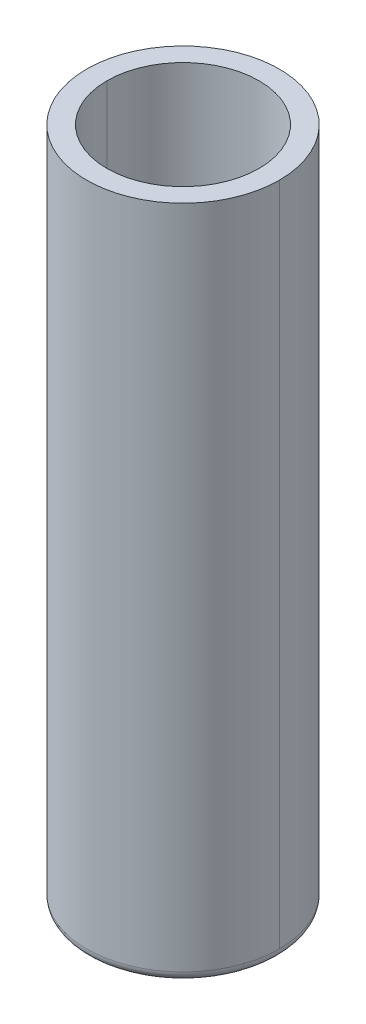
ISO-10303-21;
HEADER;
FILE_DESCRIPTION(('STEP AP214'),'2;1');
FILE_NAME('part.step','',(''),(''),'','','');
FILE_SCHEMA(('AUTOMOTIVE_DESIGN { 1 0 10303 214 1 1 1 1 }'));
ENDSEC;
DATA;
#1=APPLICATION_CONTEXT('core data for automotive mechanical design processes');
#2=APPLICATION_PROTOCOL_DEFINITION('international standard','automotive_design',2000,#1);
#3=PRODUCT_CONTEXT('',#1,'mechanical');
#4=PRODUCT('Part','Part','',(#3));
#5=PRODUCT_RELATED_PRODUCT_CATEGORY('part','',(#4));
#6=PRODUCT_DEFINITION_FORMATION('','',#4);
#7=PRODUCT_DEFINITION_CONTEXT('part definition',#1,'design');
#8=PRODUCT_DEFINITION('design','',#6,#7);
#9=PRODUCT_DEFINITION_SHAPE('','',#8);
#10=(LENGTH_UNIT() NAMED_UNIT(*) SI_UNIT(.MILLI.,.METRE.));
#11=(NAMED_UNIT(*) PLANE_ANGLE_UNIT() SI_UNIT($,.RADIAN.));
#12=(NAMED_UNIT(*) SI_UNIT($,.STERADIAN.) SOLID_ANGLE_UNIT());
#13=UNCERTAINTY_MEASURE_WITH_UNIT(LENGTH_MEASURE(1.E-05),#10,'distance_accuracy_value','');
#14=(GEOMETRIC_REPRESENTATION_CONTEXT(3) GLOBAL_UNCERTAINTY_ASSIGNED_CONTEXT((#13)) GLOBAL_UNIT_ASSIGNED_CONTEXT((#10,
#11,#12)) REPRESENTATION_CONTEXT('',''));
#15=CARTESIAN_POINT('',(0.,0.,0.));
#16=DIRECTION('',(0.,0.,1.));
#17=DIRECTION('',(1.,0.,0.));
#18=AXIS2_PLACEMENT_3D('',#15,#16,#17);
#19=CARTESIAN_POINT('',(0.,0.644355282187,0.774237036705));
#20=DIRECTION('',(0.,1.,0.));
#21=DIRECTION('',(0.,0.,1.));
#22=AXIS2_PLACEMENT_3D('',#19,#20,#21);
#23=PLANE('',#22);
#24=CARTESIAN_POINT('',(0.,0.644355282187,0.));
#25=DIRECTION('',(0.,-1.,0.));
#26=DIRECTION('',(0.,0.,-1.));
#27=AXIS2_PLACEMENT_3D('',#24,#25,#26);
#28=CIRCLE('',#27,0.774237036705);
#29=CARTESIAN_POINT('',(0.371189008329905,0.644355282187,0.679456922181827));
#30=VERTEX_POINT('',#29);
#31=EDGE_CURVE('E19',#30,#30,#28,.T.);
#32=ORIENTED_EDGE('',*,*,#31,.T.);
#33=EDGE_LOOP('',(#32));
#34=FACE_BOUND('',#33,.T.);
#35=ADVANCED_FACE('F16',(#34),#23,.F.);
#36=CARTESIAN_POINT('',(0.,0.323807125575,1.3491904568));
#37=CARTESIAN_POINT('',(0.,0.353262221282,1.32215549052));
#38=CARTESIAN_POINT('',(0.,0.381219804809,1.29383961818));
#39=CARTESIAN_POINT('',(0.,0.407679876157,1.2642428398));
#40=CARTESIAN_POINT('',(0.,0.488846989831,1.16384237585));
#41=CARTESIAN_POINT('',(0.,0.554181499343,1.04989939876));
#42=CARTESIAN_POINT('',(0.,0.591831059317,0.964505493118001));
#43=CARTESIAN_POINT('',(0.,0.621888986932,0.8726180391));
#44=CARTESIAN_POINT('',(0.,0.644355282187,0.774237036705));
#45=(BOUNDED_CURVE() B_SPLINE_CURVE(5,(#36,#37,#38,#39,#40,#41,#42,#43,#44),.UNSPECIFIED.,.F.,
.F.) B_SPLINE_CURVE_WITH_KNOTS((6,3,6),(0.,0.307545236470841,1.),
.UNSPECIFIED.) CURVE() GEOMETRIC_REPRESENTATION_ITEM() RATIONAL_B_SPLINE_CURVE((1.,1.,1.,1.,1.,
1.,1.,1.,1.)) REPRESENTATION_ITEM(''));
#46=CARTESIAN_POINT('',(0.,0.218004316092,0.));
#47=DIRECTION('',(0.,-1.,0.));
#48=AXIS1_PLACEMENT('',#46,#47);
#49=SURFACE_OF_REVOLUTION('',#45,#48);
#50=ORIENTED_EDGE('',*,*,#31,.F.);
#51=EDGE_LOOP('',(#50));
#52=FACE_BOUND('',#51,.T.);
#53=CARTESIAN_POINT('',(0.,0.32380712557507,0.));
#54=DIRECTION('',(0.,1.,0.));
#55=DIRECTION('',(0.479425538604204,0.,0.877582561890372));
#56=AXIS2_PLACEMENT_3D('',#53,#54,#55);
#57=CIRCLE('',#56,1.34919045680404);
#58=CARTESIAN_POINT('',(0.646836361431484,0.323807125575035,1.18402601755862));
#59=VERTEX_POINT('',#58);
#60=CARTESIAN_POINT('',(-0.646836361431364,0.323807125575693,-1.184026017558));
#61=VERTEX_POINT('',#60);
#62=EDGE_CURVE('E73',#59,#61,#57,.T.);
#63=ORIENTED_EDGE('',*,*,#62,.F.);
#64=CARTESIAN_POINT('',(0.,0.323807125576386,0.));
#65=DIRECTION('',(0.,1.,0.));
#66=DIRECTION('',(0.479425538604204,0.,0.877582561890372));
#67=AXIS2_PLACEMENT_3D('',#64,#65,#66);
#68=CIRCLE('',#67,1.34919045680283);
#69=EDGE_CURVE('E71',#61,#59,#68,.T.);
#70=ORIENTED_EDGE('',*,*,#69,.F.);
#71=EDGE_LOOP('',(#63,#70));
#72=FACE_BOUND('',#71,.T.);
#73=ADVANCED_FACE('F228',(#52,#72),#49,.T.);
#74=CARTESIAN_POINT('',(0.,2.,0.));
#75=DIRECTION('',(0.,1.,0.));
#76=DIRECTION('',(0.,0.,1.));
#77=AXIS2_PLACEMENT_3D('',#74,#75,#76);
#78=PLANE('',#77);
#79=CARTESIAN_POINT('',(0.,2.,0.));
#80=DIRECTION('',(0.,1.,0.));
#81=DIRECTION('',(0.,0.,1.));
#82=AXIS2_PLACEMENT_3D('',#79,#80,#81);
#83=CIRCLE('',#82,2.25);
#84=CARTESIAN_POINT('',(-2.25,2.,0.));
#85=VERTEX_POINT('',#84);
#86=CARTESIAN_POINT('',(2.25,2.,0.));
#87=VERTEX_POINT('',#86);
#88=EDGE_CURVE('E64',#85,#87,#83,.T.);
#89=ORIENTED_EDGE('',*,*,#88,.T.);
#90=CARTESIAN_POINT('',(0.,2.,0.));
#91=DIRECTION('',(0.,1.,0.));
#92=DIRECTION('',(0.,0.,1.));
#93=AXIS2_PLACEMENT_3D('',#90,#91,#92);
#94=CIRCLE('',#93,2.25);
#95=EDGE_CURVE('E352',#87,#85,#94,.T.);
#96=ORIENTED_EDGE('',*,*,#95,.T.);
#97=EDGE_LOOP('',(#89,#96));
#98=FACE_BOUND('',#97,.T.);
#99=ADVANCED_FACE('F220',(#98),#78,.T.);
#100=CARTESIAN_POINT('',(0.,1.,0.));
#101=DIRECTION('',(0.,1.,0.));
#102=DIRECTION('',(0.479425538604204,0.,0.877582561890372));
#103=AXIS2_PLACEMENT_3D('',#100,#101,#102);
#104=TOROIDAL_SURFACE('',#103,2.08591509775,1.);
#105=CARTESIAN_POINT('',(0.,0.,0.));
#106=DIRECTION('',(0.,-1.,0.));
#107=DIRECTION('',(-0.479425480048572,0.,-0.877582593879457));
#108=AXIS2_PLACEMENT_3D('',#105,#106,#107);
#109=CIRCLE('',#108,2.08591509775055);
#110=CARTESIAN_POINT('',(-1.00004084707962,0.,-1.83056278209625));
#111=VERTEX_POINT('',#110);
#112=EDGE_CURVE('E36',#111,#111,#109,.T.);
#113=ORIENTED_EDGE('',*,*,#112,.T.);
#114=EDGE_LOOP('',(#113));
#115=FACE_BOUND('',#114,.T.);
#116=ORIENTED_EDGE('',*,*,#62,.T.);
#117=ORIENTED_EDGE('',*,*,#69,.T.);
#118=EDGE_LOOP('',(#116,#117));
#119=FACE_BOUND('',#118,.T.);
#120=ADVANCED_FACE('F212',(#115,#119),#104,.T.);
#121=CARTESIAN_POINT('',(0.,11.,0.));
#122=DIRECTION('',(0.,1.,0.));
#123=DIRECTION('',(0.,0.,1.));
#124=AXIS2_PLACEMENT_3D('',#121,#122,#123);
#125=CYLINDRICAL_SURFACE('',#124,2.25);
#126=CARTESIAN_POINT('',(0.,20.,0.));
#127=DIRECTION('',(0.,1.,0.));
#128=DIRECTION('',(0.,0.,1.));
#129=AXIS2_PLACEMENT_3D('',#126,#127,#128);
#130=CIRCLE('',#129,2.25);
#131=CARTESIAN_POINT('',(2.25,20.,0.));
#132=VERTEX_POINT('',#131);
#133=CARTESIAN_POINT('',(-2.25,20.,0.));
#134=VERTEX_POINT('',#133);
#135=EDGE_CURVE('E349',#132,#134,#130,.F.);
#136=ORIENTED_EDGE('',*,*,#135,.F.);
#137=DIRECTION('',(0.,1.,0.));
#138=VECTOR('',#137,1.);
#139=CARTESIAN_POINT('',(2.25,11.,0.));
#140=LINE('',#139,#138);
#141=EDGE_CURVE('E363',#132,#87,#140,.F.);
#142=ORIENTED_EDGE('',*,*,#141,.T.);
#143=ORIENTED_EDGE('',*,*,#88,.F.);
#144=DIRECTION('',(0.,1.,0.));
#145=VECTOR('',#144,1.);
#146=CARTESIAN_POINT('',(-2.25,11.,0.));
#147=LINE('',#146,#145);
#148=EDGE_CURVE('E154',#85,#134,#147,.T.);
#149=ORIENTED_EDGE('',*,*,#148,.T.);
#150=EDGE_LOOP('',(#136,#142,#143,#149));
#151=FACE_BOUND('',#150,.T.);
#152=ADVANCED_FACE('F204',(#151),#125,.F.);
#153=CARTESIAN_POINT('',(0.,11.,0.));
#154=DIRECTION('',(0.,1.,0.));
#155=DIRECTION('',(0.,0.,1.));
#156=AXIS2_PLACEMENT_3D('',#153,#154,#155);
#157=CYLINDRICAL_SURFACE('',#156,2.25);
#158=CARTESIAN_POINT('',(0.,20.,0.));
#159=DIRECTION('',(0.,1.,0.));
#160=DIRECTION('',(0.,0.,1.));
#161=AXIS2_PLACEMENT_3D('',#158,#159,#160);
#162=CIRCLE('',#161,2.25);
#163=EDGE_CURVE('E345',#134,#132,#162,.F.);
#164=ORIENTED_EDGE('',*,*,#163,.F.);
#165=ORIENTED_EDGE('',*,*,#148,.F.);
#166=ORIENTED_EDGE('',*,*,#95,.F.);
#167=ORIENTED_EDGE('',*,*,#141,.F.);
#168=EDGE_LOOP('',(#164,#165,#166,#167));
#169=FACE_BOUND('',#168,.T.);
#170=ADVANCED_FACE('F135',(#169),#157,.F.);
#171=CARTESIAN_POINT('',(0.,0.,0.));
#172=DIRECTION('',(0.,1.,0.));
#173=DIRECTION('',(0.,0.,1.));
#174=AXIS2_PLACEMENT_3D('',#171,#172,#173);
#175=PLANE('',#174);
#176=ORIENTED_EDGE('',*,*,#112,.F.);
#177=EDGE_LOOP('',(#176));
#178=FACE_BOUND('',#177,.T.);
#179=CARTESIAN_POINT('',(0.,0.,0.));
#180=DIRECTION('',(0.,1.,0.));
#181=DIRECTION('',(1.,0.,0.));
#182=AXIS2_PLACEMENT_3D('',#179,#180,#181);
#183=CIRCLE('',#182,2.55);
#184=CARTESIAN_POINT('',(2.55,0.,0.));
#185=VERTEX_POINT('',#184);
#186=EDGE_CURVE('E92',#185,#185,#183,.T.);
#187=ORIENTED_EDGE('',*,*,#186,.F.);
#188=EDGE_LOOP('',(#187));
#189=FACE_BOUND('',#188,.T.);
#190=ADVANCED_FACE('F124',(#178,#189),#175,.F.);
#191=CARTESIAN_POINT('',(0.,20.,0.));
#192=DIRECTION('',(0.,1.,0.));
#193=DIRECTION('',(0.,0.,1.));
#194=AXIS2_PLACEMENT_3D('',#191,#192,#193);
#195=PLANE('',#194);
#196=ORIENTED_EDGE('',*,*,#135,.T.);
#197=ORIENTED_EDGE('',*,*,#163,.T.);
#198=EDGE_LOOP('',(#196,#197));
#199=FACE_BOUND('',#198,.T.);
#200=CARTESIAN_POINT('',(0.,20.,0.));
#201=DIRECTION('',(0.,1.,0.));
#202=DIRECTION('',(0.,0.,1.));
#203=AXIS2_PLACEMENT_3D('',#200,#201,#202);
#204=CIRCLE('',#203,2.85);
#205=CARTESIAN_POINT('',(2.85,20.,0.));
#206=VERTEX_POINT('',#205);
#207=CARTESIAN_POINT('',(-2.85,20.,0.));
#208=VERTEX_POINT('',#207);
#209=EDGE_CURVE('E91',#206,#208,#204,.F.);
#210=ORIENTED_EDGE('',*,*,#209,.F.);
#211=CARTESIAN_POINT('',(0.,20.,0.));
#212=DIRECTION('',(0.,1.,0.));
#213=DIRECTION('',(0.,0.,1.));
#214=AXIS2_PLACEMENT_3D('',#211,#212,#213);
#215=CIRCLE('',#214,2.85);
#216=EDGE_CURVE('E86',#208,#206,#215,.F.);
#217=ORIENTED_EDGE('',*,*,#216,.F.);
#218=EDGE_LOOP('',(#210,#217));
#219=FACE_BOUND('',#218,.T.);
#220=ADVANCED_FACE('F134',(#199,#219),#195,.T.);
#221=CARTESIAN_POINT('',(0.,10.,0.));
#222=DIRECTION('',(0.,1.,0.));
#223=DIRECTION('',(0.,0.,1.));
#224=AXIS2_PLACEMENT_3D('',#221,#222,#223);
#225=CYLINDRICAL_SURFACE('',#224,2.85);
#226=DIRECTION('',(0.,1.,0.));
#227=VECTOR('',#226,1.);
#228=CARTESIAN_POINT('',(2.85,10.,0.));
#229=LINE('',#228,#227);
#230=CARTESIAN_POINT('',(2.85,0.3,0.));
#231=VERTEX_POINT('',#230);
#232=EDGE_CURVE('E80',#231,#206,#229,.T.);
#233=ORIENTED_EDGE('',*,*,#232,.F.);
#234=CARTESIAN_POINT('',(0.,0.3,0.));
#235=DIRECTION('',(0.,1.,0.));
#236=DIRECTION('',(1.,0.,0.));
#237=AXIS2_PLACEMENT_3D('',#234,#235,#236);
#238=CIRCLE('',#237,2.85);
#239=CARTESIAN_POINT('',(-2.85,0.3,0.));
#240=VERTEX_POINT('',#239);
#241=EDGE_CURVE('E84',#240,#231,#238,.F.);
#242=ORIENTED_EDGE('',*,*,#241,.F.);
#243=DIRECTION('',(0.,1.,0.));
#244=VECTOR('',#243,1.);
#245=CARTESIAN_POINT('',(-2.85,10.,0.));
#246=LINE('',#245,#244);
#247=EDGE_CURVE('E25',#208,#240,#246,.F.);
#248=ORIENTED_EDGE('',*,*,#247,.F.);
#249=ORIENTED_EDGE('',*,*,#216,.T.);
#250=EDGE_LOOP('',(#233,#242,#248,#249));
#251=FACE_BOUND('',#250,.T.);
#252=ADVANCED_FACE('F82',(#251),#225,.T.);
#253=CARTESIAN_POINT('',(0.,0.3,0.));
#254=DIRECTION('',(0.,1.,0.));
#255=DIRECTION('',(1.,0.,0.));
#256=AXIS2_PLACEMENT_3D('',#253,#254,#255);
#257=TOROIDAL_SURFACE('',#256,2.55,0.3);
#258=ORIENTED_EDGE('',*,*,#186,.T.);
#259=EDGE_LOOP('',(#258));
#260=FACE_BOUND('',#259,.T.);
#261=CARTESIAN_POINT('',(0.,0.3,0.));
#262=DIRECTION('',(0.,1.,0.));
#263=DIRECTION('',(0.,0.,1.));
#264=AXIS2_PLACEMENT_3D('',#261,#262,#263);
#265=CIRCLE('',#264,2.85);
#266=EDGE_CURVE('E11',#240,#231,#265,.T.);
#267=ORIENTED_EDGE('',*,*,#266,.F.);
#268=ORIENTED_EDGE('',*,*,#241,.T.);
#269=EDGE_LOOP('',(#267,#268));
#270=FACE_BOUND('',#269,.T.);
#271=ADVANCED_FACE('F95',(#260,#270),#257,.T.);
#272=CARTESIAN_POINT('',(0.,10.,0.));
#273=DIRECTION('',(0.,1.,0.));
#274=DIRECTION('',(0.,0.,1.));
#275=AXIS2_PLACEMENT_3D('',#272,#273,#274);
#276=CYLINDRICAL_SURFACE('',#275,2.85);
#277=ORIENTED_EDGE('',*,*,#247,.T.);
#278=ORIENTED_EDGE('',*,*,#266,.T.);
#279=ORIENTED_EDGE('',*,*,#232,.T.);
#280=ORIENTED_EDGE('',*,*,#209,.T.);
#281=EDGE_LOOP('',(#277,#278,#279,#280));
#282=FACE_BOUND('',#281,.T.);
#283=ADVANCED_FACE('F99',(#282),#276,.T.);
#284=CLOSED_SHELL('',(#35,#73,#99,#120,#152,#170,#190,#220,#252,#271,#283));
#285=MANIFOLD_SOLID_BREP('B1',#284);
#286=ADVANCED_BREP_SHAPE_REPRESENTATION('',(#18,#285),#14);
#287=SHAPE_DEFINITION_REPRESENTATION(#9,#286);
ENDSEC;
END-ISO-10303-21;
